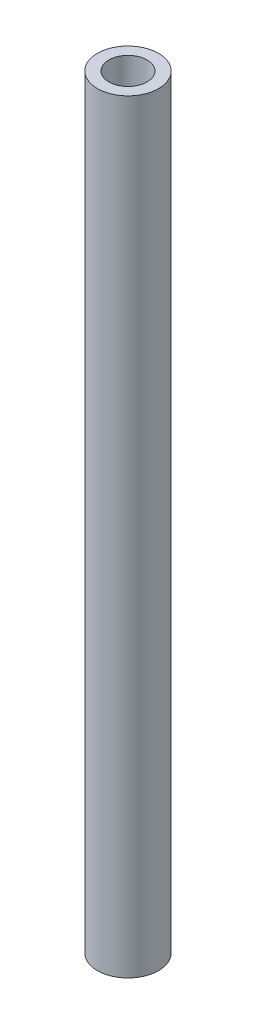
ISO-10303-21;
HEADER;
FILE_DESCRIPTION(('STEP AP214'),'2;1');
FILE_NAME('part.step','',(''),(''),'','','');
FILE_SCHEMA(('AUTOMOTIVE_DESIGN { 1 0 10303 214 1 1 1 1 }'));
ENDSEC;
DATA;
#1=APPLICATION_CONTEXT('core data for automotive mechanical design processes');
#2=APPLICATION_PROTOCOL_DEFINITION('international standard','automotive_design',2000,#1);
#3=PRODUCT_CONTEXT('',#1,'mechanical');
#4=PRODUCT('Part','Part','',(#3));
#5=PRODUCT_RELATED_PRODUCT_CATEGORY('part','',(#4));
#6=PRODUCT_DEFINITION_FORMATION('','',#4);
#7=PRODUCT_DEFINITION_CONTEXT('part definition',#1,'design');
#8=PRODUCT_DEFINITION('design','',#6,#7);
#9=PRODUCT_DEFINITION_SHAPE('','',#8);
#10=(LENGTH_UNIT() NAMED_UNIT(*) SI_UNIT(.MILLI.,.METRE.));
#11=(NAMED_UNIT(*) PLANE_ANGLE_UNIT() SI_UNIT($,.RADIAN.));
#12=(NAMED_UNIT(*) SI_UNIT($,.STERADIAN.) SOLID_ANGLE_UNIT());
#13=UNCERTAINTY_MEASURE_WITH_UNIT(LENGTH_MEASURE(1.E-05),#10,'distance_accuracy_value','');
#14=(GEOMETRIC_REPRESENTATION_CONTEXT(3) GLOBAL_UNCERTAINTY_ASSIGNED_CONTEXT((#13)) GLOBAL_UNIT_ASSIGNED_CONTEXT((#10,
#11,#12)) REPRESENTATION_CONTEXT('',''));
#15=CARTESIAN_POINT('',(0.,0.,0.));
#16=DIRECTION('',(0.,0.,1.));
#17=DIRECTION('',(1.,0.,0.));
#18=AXIS2_PLACEMENT_3D('',#15,#16,#17);
#19=CARTESIAN_POINT('',(0.,100.,0.));
#20=DIRECTION('',(0.,1.,0.));
#21=DIRECTION('',(0.,0.,1.));
#22=AXIS2_PLACEMENT_3D('',#19,#20,#21);
#23=PLANE('',#22);
#24=CARTESIAN_POINT('',(0.,100.,0.));
#25=DIRECTION('',(0.,1.,0.));
#26=DIRECTION('',(0.,0.,1.));
#27=AXIS2_PLACEMENT_3D('',#24,#25,#26);
#28=CIRCLE('',#27,4.);
#29=CARTESIAN_POINT('',(0.,100.,4.));
#30=VERTEX_POINT('',#29);
#31=EDGE_CURVE('E10',#30,#30,#28,.T.);
#32=ORIENTED_EDGE('',*,*,#31,.T.);
#33=EDGE_LOOP('',(#32));
#34=FACE_BOUND('',#33,.T.);
#35=CARTESIAN_POINT('',(0.,100.,0.));
#36=DIRECTION('',(0.,1.,0.));
#37=DIRECTION('',(0.,0.,1.));
#38=AXIS2_PLACEMENT_3D('',#35,#36,#37);
#39=CIRCLE('',#38,2.5);
#40=CARTESIAN_POINT('',(0.,100.,2.5));
#41=VERTEX_POINT('',#40);
#42=EDGE_CURVE('E50',#41,#41,#39,.T.);
#43=ORIENTED_EDGE('',*,*,#42,.F.);
#44=EDGE_LOOP('',(#43));
#45=FACE_BOUND('',#44,.T.);
#46=ADVANCED_FACE('F37',(#34,#45),#23,.T.);
#47=CARTESIAN_POINT('',(0.,0.,0.));
#48=DIRECTION('',(0.,1.,0.));
#49=DIRECTION('',(0.,0.,1.));
#50=AXIS2_PLACEMENT_3D('',#47,#48,#49);
#51=PLANE('',#50);
#52=CARTESIAN_POINT('',(0.,0.,0.));
#53=DIRECTION('',(0.,1.,0.));
#54=DIRECTION('',(0.,0.,1.));
#55=AXIS2_PLACEMENT_3D('',#52,#53,#54);
#56=CIRCLE('',#55,4.);
#57=CARTESIAN_POINT('',(0.,0.,4.));
#58=VERTEX_POINT('',#57);
#59=EDGE_CURVE('E41',#58,#58,#56,.T.);
#60=ORIENTED_EDGE('',*,*,#59,.F.);
#61=EDGE_LOOP('',(#60));
#62=FACE_BOUND('',#61,.T.);
#63=CARTESIAN_POINT('',(0.,0.,0.));
#64=DIRECTION('',(0.,1.,0.));
#65=DIRECTION('',(0.,0.,1.));
#66=AXIS2_PLACEMENT_3D('',#63,#64,#65);
#67=CIRCLE('',#66,2.5);
#68=CARTESIAN_POINT('',(0.,0.,2.5));
#69=VERTEX_POINT('',#68);
#70=EDGE_CURVE('E52',#69,#69,#67,.T.);
#71=ORIENTED_EDGE('',*,*,#70,.T.);
#72=EDGE_LOOP('',(#71));
#73=FACE_BOUND('',#72,.T.);
#74=ADVANCED_FACE('F64',(#62,#73),#51,.F.);
#75=CARTESIAN_POINT('',(0.,100.,0.));
#76=DIRECTION('',(0.,-1.,0.));
#77=DIRECTION('',(0.,0.,-1.));
#78=AXIS2_PLACEMENT_3D('',#75,#76,#77);
#79=CYLINDRICAL_SURFACE('',#78,4.);
#80=ORIENTED_EDGE('',*,*,#31,.F.);
#81=EDGE_LOOP('',(#80));
#82=FACE_BOUND('',#81,.T.);
#83=ORIENTED_EDGE('',*,*,#59,.T.);
#84=EDGE_LOOP('',(#83));
#85=FACE_BOUND('',#84,.T.);
#86=ADVANCED_FACE('F39',(#82,#85),#79,.T.);
#87=CARTESIAN_POINT('',(0.,100.,0.));
#88=DIRECTION('',(0.,-1.,0.));
#89=DIRECTION('',(0.,0.,-1.));
#90=AXIS2_PLACEMENT_3D('',#87,#88,#89);
#91=CYLINDRICAL_SURFACE('',#90,2.5);
#92=ORIENTED_EDGE('',*,*,#42,.T.);
#93=EDGE_LOOP('',(#92));
#94=FACE_BOUND('',#93,.T.);
#95=ORIENTED_EDGE('',*,*,#70,.F.);
#96=EDGE_LOOP('',(#95));
#97=FACE_BOUND('',#96,.T.);
#98=ADVANCED_FACE('F60',(#94,#97),#91,.F.);
#99=CLOSED_SHELL('',(#46,#74,#86,#98));
#100=MANIFOLD_SOLID_BREP('B2',#99);
#101=ADVANCED_BREP_SHAPE_REPRESENTATION('',(#18,#100),#14);
#102=SHAPE_DEFINITION_REPRESENTATION(#9,#101);
ENDSEC;
END-ISO-10303-21;
